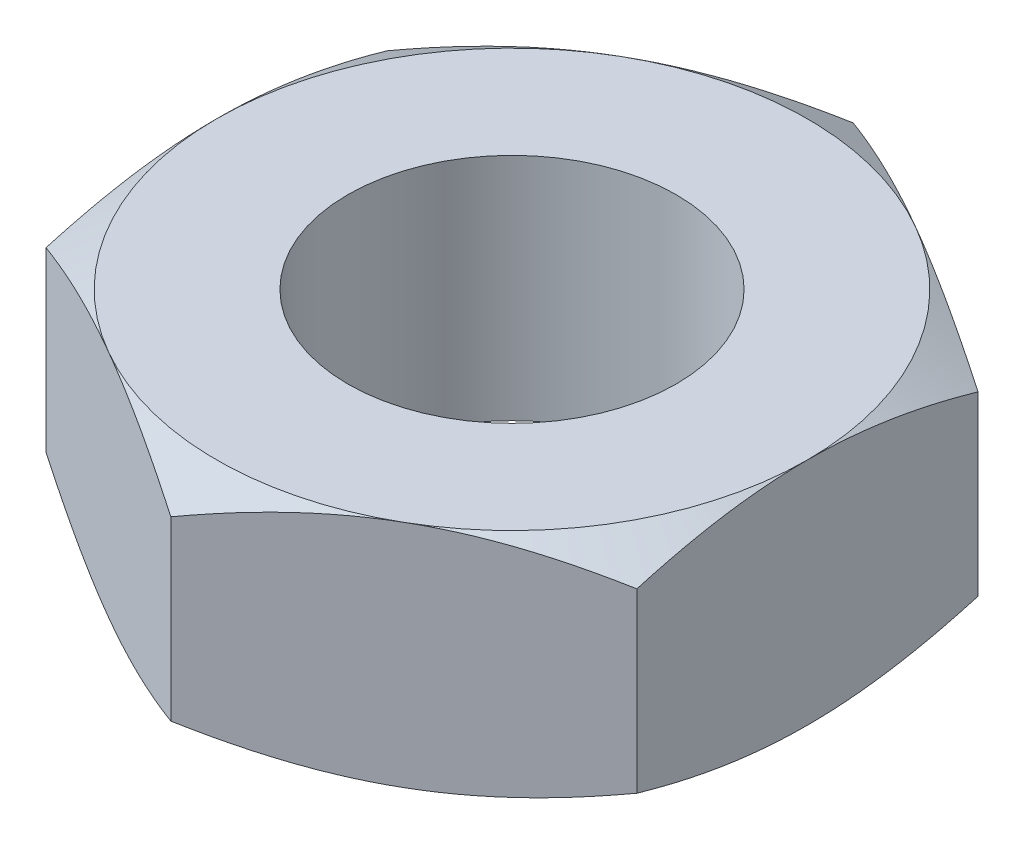
ISO-10303-21;
HEADER;
FILE_DESCRIPTION(('STEP AP214'),'2;1');
FILE_NAME('part.step','',(''),(''),'','','');
FILE_SCHEMA(('AUTOMOTIVE_DESIGN { 1 0 10303 214 1 1 1 1 }'));
ENDSEC;
DATA;
#1=APPLICATION_CONTEXT('core data for automotive mechanical design processes');
#2=APPLICATION_PROTOCOL_DEFINITION('international standard','automotive_design',2000,#1);
#3=PRODUCT_CONTEXT('',#1,'mechanical');
#4=PRODUCT('Part','Part','',(#3));
#5=PRODUCT_RELATED_PRODUCT_CATEGORY('part','',(#4));
#6=PRODUCT_DEFINITION_FORMATION('','',#4);
#7=PRODUCT_DEFINITION_CONTEXT('part definition',#1,'design');
#8=PRODUCT_DEFINITION('design','',#6,#7);
#9=PRODUCT_DEFINITION_SHAPE('','',#8);
#10=(LENGTH_UNIT() NAMED_UNIT(*) SI_UNIT(.MILLI.,.METRE.));
#11=(NAMED_UNIT(*) PLANE_ANGLE_UNIT() SI_UNIT($,.RADIAN.));
#12=(NAMED_UNIT(*) SI_UNIT($,.STERADIAN.) SOLID_ANGLE_UNIT());
#13=UNCERTAINTY_MEASURE_WITH_UNIT(LENGTH_MEASURE(1.E-05),#10,'distance_accuracy_value','');
#14=(GEOMETRIC_REPRESENTATION_CONTEXT(3) GLOBAL_UNCERTAINTY_ASSIGNED_CONTEXT((#13)) GLOBAL_UNIT_ASSIGNED_CONTEXT((#10,
#11,#12)) REPRESENTATION_CONTEXT('',''));
#15=CARTESIAN_POINT('',(0.,0.,0.));
#16=DIRECTION('',(0.,0.,1.));
#17=DIRECTION('',(1.,0.,0.));
#18=AXIS2_PLACEMENT_3D('',#15,#16,#17);
#19=CARTESIAN_POINT('',(-2.25,1.75,1.29903810567666));
#20=DIRECTION('',(0.5,0.,-0.866025403784439));
#21=DIRECTION('',(-0.866025403784439,0.,-0.5));
#22=AXIS2_PLACEMENT_3D('',#19,#20,#21);
#23=PLANE('',#22);
#24=CARTESIAN_POINT('',(0.000200000000000523,0.201028565434255,2.59819168140715));
#25=CARTESIAN_POINT('',(-0.0986772488143569,0.168055578047864,2.54110487518746));
#26=CARTESIAN_POINT('',(-0.198407997179093,0.138067535415598,2.48352530077259));
#27=CARTESIAN_POINT('',(-0.399596540220632,0.0857223882308779,2.36736904128969));
#28=CARTESIAN_POINT('',(-0.501057910502945,0.0633838027064784,2.30879029184485));
#29=CARTESIAN_POINT('',(-0.702723189801078,0.0286095576734186,2.19235878855587));
#30=CARTESIAN_POINT('',(-0.802896064976672,0.0159424738337182,2.13452395210774));
#31=CARTESIAN_POINT('',(-1.00371331260268,0.000818907417418888,2.01858206013295));
#32=CARTESIAN_POINT('',(-1.1043569548332,-0.00165009697600151,1.96047542619893));
#33=CARTESIAN_POINT('',(-1.29242516452656,0.00347837463602921,1.85189419470646));
#34=CARTESIAN_POINT('',(-1.37987784389126,0.00981663451512018,1.8014033667339));
#35=CARTESIAN_POINT('',(-1.55421343210877,0.0299076571898889,1.70075066794718));
#36=CARTESIAN_POINT('',(-1.64109573768829,0.0436672872310836,1.65058914543304));
#37=CARTESIAN_POINT('',(-1.81579095410174,0.0780662653506656,1.54972881521059));
#38=CARTESIAN_POINT('',(-1.90358174743525,0.0988514715826556,1.49904277704711));
#39=CARTESIAN_POINT('',(-2.0778537368776,0.146026087362979,1.39842679703037));
#40=CARTESIAN_POINT('',(-2.164337166751,0.172404408014302,1.34849556551251));
#41=CARTESIAN_POINT('',(-2.2502,0.201028565434255,1.29892263562282));
#42=B_SPLINE_CURVE_WITH_KNOTS('',3,(#24,#25,#26,#27,#28,#29,#30,#31,#32,#33,#34,#35,#36,#37,#38,
#39,#40,#41),.UNSPECIFIED.,.F.,.F.,(4,2,2,2,2,2,2,2,4),(0.,0.356658826016552,0.714175103224236,
1.06284241804968,1.41108149062516,1.71433394539794,2.01786749258222,2.32813511279245,
2.6377932546036),.UNSPECIFIED.);
#43=CARTESIAN_POINT('',(0.,0.200961894323341,2.59807621135332));
#44=VERTEX_POINT('',#43);
#45=CARTESIAN_POINT('',(-1.125,0.,1.94855715851499));
#46=VERTEX_POINT('',#45);
#47=EDGE_CURVE('E143',#44,#46,#42,.T.);
#48=ORIENTED_EDGE('',*,*,#47,.F.);
#49=DIRECTION('',(0.,-1.,0.));
#50=VECTOR('',#49,1.);
#51=CARTESIAN_POINT('',(0.,1.75,2.59807621135332));
#52=LINE('',#51,#50);
#53=CARTESIAN_POINT('',(0.,1.54903810567666,2.59807621135332));
#54=VERTEX_POINT('',#53);
#55=EDGE_CURVE('E155',#54,#44,#52,.T.);
#56=ORIENTED_EDGE('',*,*,#55,.F.);
#57=CARTESIAN_POINT('',(-2.2502,1.54897143456575,1.29892263562282));
#58=CARTESIAN_POINT('',(-2.15132275118564,1.58194442195214,1.35600944184252));
#59=CARTESIAN_POINT('',(-2.05159200282091,1.6119324645844,1.41358901625738));
#60=CARTESIAN_POINT('',(-1.85040345977937,1.66427761176912,1.52974527574028));
#61=CARTESIAN_POINT('',(-1.74894208949705,1.68661619729352,1.58832402518512));
#62=CARTESIAN_POINT('',(-1.54727681019892,1.72139044232658,1.7047555284741));
#63=CARTESIAN_POINT('',(-1.44710393502333,1.73405752616628,1.76259036492223));
#64=CARTESIAN_POINT('',(-1.24628668739732,1.74918109258258,1.87853225689702));
#65=CARTESIAN_POINT('',(-1.1456430451668,1.751650096976,1.93663889083104));
#66=CARTESIAN_POINT('',(-0.957574835473435,1.74652162536397,2.04522012232352));
#67=CARTESIAN_POINT('',(-0.870122156108742,1.74018336548488,2.09571095029608));
#68=CARTESIAN_POINT('',(-0.695786567891226,1.72009234281011,2.19636364908279));
#69=CARTESIAN_POINT('',(-0.608904262311712,1.70633271276892,2.24652517159694));
#70=CARTESIAN_POINT('',(-0.434209045898264,1.67193373464933,2.34738550181938));
#71=CARTESIAN_POINT('',(-0.346418252564746,1.65114852841734,2.39807153998286));
#72=CARTESIAN_POINT('',(-0.172146263122404,1.60397391263702,2.49868751999961));
#73=CARTESIAN_POINT('',(-0.085662833248997,1.5775955919857,2.54861875151746));
#74=CARTESIAN_POINT('',(0.000200000000000707,1.54897143456575,2.59819168140715));
#75=B_SPLINE_CURVE_WITH_KNOTS('',3,(#57,#58,#59,#60,#61,#62,#63,#64,#65,#66,#67,#68,#69,#70,#71,
#72,#73,#74),.UNSPECIFIED.,.F.,.F.,(4,2,2,2,2,2,2,2,4),(0.,0.356658826016552,0.714175103224236,
1.06284241804968,1.41108149062516,1.71433394539794,2.01786749258222,2.32813511279245,
2.63779325460359),.UNSPECIFIED.);
#76=CARTESIAN_POINT('',(-1.125,1.75,1.94855715851499));
#77=VERTEX_POINT('',#76);
#78=EDGE_CURVE('E315',#77,#54,#75,.T.);
#79=ORIENTED_EDGE('',*,*,#78,.F.);
#80=CARTESIAN_POINT('',(-2.25,1.54903810567666,1.29903810567667));
#81=VERTEX_POINT('',#80);
#82=EDGE_CURVE('E307',#81,#77,#75,.T.);
#83=ORIENTED_EDGE('',*,*,#82,.F.);
#84=DIRECTION('',(0.,-1.,0.));
#85=VECTOR('',#84,1.);
#86=CARTESIAN_POINT('',(-2.25,1.75,1.29903810567666));
#87=LINE('',#86,#85);
#88=CARTESIAN_POINT('',(-2.25,0.200961894323341,1.29903810567666));
#89=VERTEX_POINT('',#88);
#90=EDGE_CURVE('E240',#81,#89,#87,.T.);
#91=ORIENTED_EDGE('',*,*,#90,.T.);
#92=EDGE_CURVE('E206',#46,#89,#42,.T.);
#93=ORIENTED_EDGE('',*,*,#92,.F.);
#94=EDGE_LOOP('',(#48,#56,#79,#83,#91,#93));
#95=FACE_BOUND('',#94,.T.);
#96=ADVANCED_FACE('F35',(#95),#23,.F.);
#97=CARTESIAN_POINT('',(0.,1.75,2.59807621135332));
#98=DIRECTION('',(-0.5,0.,-0.866025403784439));
#99=DIRECTION('',(-0.866025403784439,0.,0.5));
#100=AXIS2_PLACEMENT_3D('',#97,#98,#99);
#101=PLANE('',#100);
#102=CARTESIAN_POINT('',(2.2502,0.201028565434255,1.29892263562282));
#103=CARTESIAN_POINT('',(2.15132275118564,0.168055578047864,1.35600944184252));
#104=CARTESIAN_POINT('',(2.05159200282091,0.138067535415598,1.41358901625738));
#105=CARTESIAN_POINT('',(1.85040345977937,0.0857223882308781,1.52974527574028));
#106=CARTESIAN_POINT('',(1.74894208949705,0.0633838027064787,1.58832402518512));
#107=CARTESIAN_POINT('',(1.54727681019892,0.0286095576734188,1.7047555284741));
#108=CARTESIAN_POINT('',(1.44710393502333,0.0159424738337183,1.76259036492223));
#109=CARTESIAN_POINT('',(1.24628668739732,0.000818907417418837,1.87853225689702));
#110=CARTESIAN_POINT('',(1.1456430451668,-0.00165009697600152,1.93663889083104));
#111=CARTESIAN_POINT('',(0.957574835473435,0.00347837463602933,2.04522012232352));
#112=CARTESIAN_POINT('',(0.870122156108742,0.00981663451512037,2.09571095029608));
#113=CARTESIAN_POINT('',(0.695786567891226,0.0299076571898891,2.19636364908279));
#114=CARTESIAN_POINT('',(0.608904262311712,0.0436672872310836,2.24652517159694));
#115=CARTESIAN_POINT('',(0.434209045898264,0.0780662653506655,2.34738550181938));
#116=CARTESIAN_POINT('',(0.346418252564747,0.0988514715826555,2.39807153998286));
#117=CARTESIAN_POINT('',(0.172146263122405,0.146026087362979,2.49868751999961));
#118=CARTESIAN_POINT('',(0.0856628332489982,0.172404408014302,2.54861875151746));
#119=CARTESIAN_POINT('',(-0.000199999999999547,0.201028565434255,2.59819168140715));
#120=B_SPLINE_CURVE_WITH_KNOTS('',3,(#102,#103,#104,#105,#106,#107,#108,#109,#110,#111,#112,
#113,#114,#115,#116,#117,#118,#119),.UNSPECIFIED.,.F.,.F.,(4,2,2,2,2,2,2,2,4),(0.,
0.356658826016552,0.714175103224236,1.06284241804968,1.41108149062516,1.71433394539794,
2.01786749258222,2.32813511279245,2.63779325460359),.UNSPECIFIED.);
#121=CARTESIAN_POINT('',(2.25,0.200961894323341,1.29903810567666));
#122=VERTEX_POINT('',#121);
#123=CARTESIAN_POINT('',(1.125,0.,1.94855715851499));
#124=VERTEX_POINT('',#123);
#125=EDGE_CURVE('E124',#122,#124,#120,.T.);
#126=ORIENTED_EDGE('',*,*,#125,.F.);
#127=DIRECTION('',(0.,-1.,0.));
#128=VECTOR('',#127,1.);
#129=CARTESIAN_POINT('',(2.25,1.75,1.29903810567666));
#130=LINE('',#129,#128);
#131=CARTESIAN_POINT('',(2.25,1.54903810567666,1.29903810567666));
#132=VERTEX_POINT('',#131);
#133=EDGE_CURVE('E237',#132,#122,#130,.T.);
#134=ORIENTED_EDGE('',*,*,#133,.F.);
#135=CARTESIAN_POINT('',(-0.00019999999999962,1.54897143456575,2.59819168140715));
#136=CARTESIAN_POINT('',(0.0986772488143578,1.58194442195214,2.54110487518745));
#137=CARTESIAN_POINT('',(0.198407997179094,1.6119324645844,2.48352530077259));
#138=CARTESIAN_POINT('',(0.399596540220633,1.66427761176912,2.36736904128969));
#139=CARTESIAN_POINT('',(0.501057910502946,1.68661619729352,2.30879029184485));
#140=CARTESIAN_POINT('',(0.702723189801079,1.72139044232658,2.19235878855587));
#141=CARTESIAN_POINT('',(0.802896064976672,1.73405752616628,2.13452395210774));
#142=CARTESIAN_POINT('',(1.00371331260268,1.74918109258258,2.01858206013295));
#143=CARTESIAN_POINT('',(1.1043569548332,1.751650096976,1.96047542619893));
#144=CARTESIAN_POINT('',(1.29242516452657,1.74652162536397,1.85189419470646));
#145=CARTESIAN_POINT('',(1.37987784389126,1.74018336548488,1.8014033667339));
#146=CARTESIAN_POINT('',(1.55421343210877,1.72009234281011,1.70075066794718));
#147=CARTESIAN_POINT('',(1.64109573768829,1.70633271276892,1.65058914543304));
#148=CARTESIAN_POINT('',(1.81579095410174,1.67193373464933,1.54972881521059));
#149=CARTESIAN_POINT('',(1.90358174743525,1.65114852841734,1.49904277704711));
#150=CARTESIAN_POINT('',(2.0778537368776,1.60397391263702,1.39842679703037));
#151=CARTESIAN_POINT('',(2.164337166751,1.5775955919857,1.34849556551251));
#152=CARTESIAN_POINT('',(2.2502,1.54897143456575,1.29892263562282));
#153=B_SPLINE_CURVE_WITH_KNOTS('',3,(#135,#136,#137,#138,#139,#140,#141,#142,#143,#144,#145,
#146,#147,#148,#149,#150,#151,#152),.UNSPECIFIED.,.F.,.F.,(4,2,2,2,2,2,2,2,4),(0.,
0.356658826016552,0.714175103224236,1.06284241804968,1.41108149062516,1.71433394539794,
2.01786749258222,2.32813511279245,2.63779325460359),.UNSPECIFIED.);
#154=CARTESIAN_POINT('',(1.125,1.75,1.94855715851499));
#155=VERTEX_POINT('',#154);
#156=EDGE_CURVE('E283',#155,#132,#153,.T.);
#157=ORIENTED_EDGE('',*,*,#156,.F.);
#158=EDGE_CURVE('E320',#54,#155,#153,.T.);
#159=ORIENTED_EDGE('',*,*,#158,.F.);
#160=ORIENTED_EDGE('',*,*,#55,.T.);
#161=EDGE_CURVE('E136',#124,#44,#120,.T.);
#162=ORIENTED_EDGE('',*,*,#161,.F.);
#163=EDGE_LOOP('',(#126,#134,#157,#159,#160,#162));
#164=FACE_BOUND('',#163,.T.);
#165=ADVANCED_FACE('F152',(#164),#101,.F.);
#166=CARTESIAN_POINT('',(2.25,1.75,1.29903810567666));
#167=DIRECTION('',(-1.,0.,0.));
#168=DIRECTION('',(0.,0.,1.));
#169=AXIS2_PLACEMENT_3D('',#166,#167,#168);
#170=PLANE('',#169);
#171=CARTESIAN_POINT('',(2.25,1.57049861982334,-4.43172912721208));
#172=CARTESIAN_POINT('',(2.25,1.51735693759208,-4.32848794492226));
#173=CARTESIAN_POINT('',(2.25,1.46450484743296,-4.22509639331572));
#174=CARTESIAN_POINT('',(2.25,1.35952530789621,-4.01794384416323));
#175=CARTESIAN_POINT('',(2.25,1.30739787204856,-3.91418283976455));
#176=CARTESIAN_POINT('',(2.25,1.20393081844307,-3.70605700815304));
#177=CARTESIAN_POINT('',(2.25,1.1525926236047,-3.60169147231438));
#178=CARTESIAN_POINT('',(2.25,1.05099117669964,-3.39243582155597));
#179=CARTESIAN_POINT('',(2.25,1.000727939927,-3.28754569919877));
#180=CARTESIAN_POINT('',(2.25,0.898925995293035,-3.07160047020286));
#181=CARTESIAN_POINT('',(2.25,0.847459290612846,-2.96051132352861));
#182=CARTESIAN_POINT('',(2.25,0.746406212005018,-2.73748183196732));
#183=CARTESIAN_POINT('',(2.25,0.696819787356087,-2.62554151013899));
#184=CARTESIAN_POINT('',(2.25,0.600100967453589,-2.40069008962637));
#185=CARTESIAN_POINT('',(2.25,0.552966929054417,-2.2877797015774));
#186=CARTESIAN_POINT('',(2.25,0.46184651106863,-2.06065851247683));
#187=CARTESIAN_POINT('',(2.25,0.417860865336629,-1.94644741538902));
#188=CARTESIAN_POINT('',(2.25,0.327293685566711,-1.69797138865069));
#189=CARTESIAN_POINT('',(2.25,0.281435016134631,-1.56343919862733));
#190=CARTESIAN_POINT('',(2.25,0.1974750705298,-1.29200018214826));
#191=CARTESIAN_POINT('',(2.25,0.159369866726331,-1.15509459630545));
#192=CARTESIAN_POINT('',(2.25,0.0942889667848679,-0.881369269399072));
#193=CARTESIAN_POINT('',(2.25,0.0671140468085101,-0.744598126937424));
#194=CARTESIAN_POINT('',(2.25,0.0257222330991211,-0.469086445681223));
#195=CARTESIAN_POINT('',(2.25,0.011497745246213,-0.330347109575203));
#196=CARTESIAN_POINT('',(2.25,0.00123269639131384,-0.120784370517545));
#197=CARTESIAN_POINT('',(2.25,-0.000315601094854527,-0.050203974634935));
#198=CARTESIAN_POINT('',(2.25,0.000422033997697038,0.0909367469657695));
#199=CARTESIAN_POINT('',(2.25,0.00270796730213807,0.161497072680062));
#200=CARTESIAN_POINT('',(2.25,0.0152377813490387,0.372864383623227));
#201=CARTESIAN_POINT('',(2.25,0.031153514657774,0.51336108414487));
#202=CARTESIAN_POINT('',(2.25,0.0764279690031744,0.79498241315873));
#203=CARTESIAN_POINT('',(2.25,0.106052731323689,0.936062007316041));
#204=CARTESIAN_POINT('',(2.25,0.175669429631058,1.21561548141805));
#205=CARTESIAN_POINT('',(2.25,0.215664560549491,1.35408854420889));
#206=CARTESIAN_POINT('',(2.25,0.301433813240795,1.62298376559588));
#207=CARTESIAN_POINT('',(2.25,0.34690627294026,1.75350414338493));
#208=CARTESIAN_POINT('',(2.25,0.442941824020628,2.01267340913791));
#209=CARTESIAN_POINT('',(2.25,0.493506146306573,2.14132183593333));
#210=CARTESIAN_POINT('',(2.25,0.598415917250672,2.3972089614727));
#211=CARTESIAN_POINT('',(2.25,0.652765191067169,2.5244460788882));
#212=CARTESIAN_POINT('',(2.25,0.7642440388293,2.77769813848635));
#213=CARTESIAN_POINT('',(2.25,0.821373763792895,2.9037130138371));
#214=CARTESIAN_POINT('',(2.25,0.934436062749627,3.1476496239965));
#215=CARTESIAN_POINT('',(2.25,0.990252927298658,3.26562520727676));
#216=CARTESIAN_POINT('',(2.25,1.10334942732948,3.50087634814471));
#217=CARTESIAN_POINT('',(2.25,1.16062911044141,3.61815188278466));
#218=CARTESIAN_POINT('',(2.25,1.27615326827056,3.85174791850405));
#219=CARTESIAN_POINT('',(2.25,1.3343939714757,3.96807028911018));
#220=CARTESIAN_POINT('',(2.25,1.45180296105985,4.20023381118101));
#221=CARTESIAN_POINT('',(2.25,1.51097116762094,4.31607500298083));
#222=CARTESIAN_POINT('',(2.25,1.57049861982334,4.43172912721208));
#223=B_SPLINE_CURVE_WITH_KNOTS('',3,(#171,#172,#173,#174,#175,#176,#177,#178,#179,#180,#181,
#182,#183,#184,#185,#186,#187,#188,#189,#190,#191,#192,#193,#194,#195,#196,#197,#198,#199,#200,
#201,#202,#203,#204,#205,#206,#207,#208,#209,#210,#211,#212,#213,#214,#215,#216,#217,#218,#219,
#220,#221,#222),.UNSPECIFIED.,.F.,.F.,(4,2,2,2,2,2,2,2,2,2,2,2,2,2,2,2,2,2,2,2,2,2,2,2,2,4),(0.,
0.348347395383933,0.696701286027883,1.04562309484171,1.39454986466947,1.76183249981756,
2.12910522031385,2.49612860556298,2.86323726307789,3.2894710608127,3.71548840311864,
4.13334452619794,4.55095546076511,4.7626532574073,4.97435109411843,5.39773666667533,
5.82970728415092,6.26181114277157,6.67631854142574,7.09092638459783,7.50595949709434,
7.92101517699111,8.31254332110153,8.70408422986847,9.09434358465051,9.48456953737431),.UNSPECIFIED.);
#224=CARTESIAN_POINT('',(2.25,0.200961894323341,-1.29903810567666));
#225=VERTEX_POINT('',#224);
#226=CARTESIAN_POINT('',(2.25,0.,0.));
#227=VERTEX_POINT('',#226);
#228=EDGE_CURVE('E51',#225,#227,#223,.T.);
#229=ORIENTED_EDGE('',*,*,#228,.F.);
#230=DIRECTION('',(0.,-1.,0.));
#231=VECTOR('',#230,1.);
#232=CARTESIAN_POINT('',(2.25,1.75,-1.29903810567666));
#233=LINE('',#232,#231);
#234=CARTESIAN_POINT('',(2.25,1.54903810567666,-1.29903810567666));
#235=VERTEX_POINT('',#234);
#236=EDGE_CURVE('E234',#235,#225,#233,.T.);
#237=ORIENTED_EDGE('',*,*,#236,.F.);
#238=CARTESIAN_POINT('',(2.25,0.179501380176658,4.43172912721208));
#239=CARTESIAN_POINT('',(2.25,0.232643062407915,4.32848794492226));
#240=CARTESIAN_POINT('',(2.25,0.285495152567038,4.22509639331572));
#241=CARTESIAN_POINT('',(2.25,0.390474692103787,4.01794384416323));
#242=CARTESIAN_POINT('',(2.25,0.442602127951438,3.91418283976455));
#243=CARTESIAN_POINT('',(2.25,0.546069181556927,3.70605700815303));
#244=CARTESIAN_POINT('',(2.25,0.597407376395302,3.60169147231438));
#245=CARTESIAN_POINT('',(2.25,0.699008823300362,3.39243582155597));
#246=CARTESIAN_POINT('',(2.25,0.749272060072998,3.28754569919877));
#247=CARTESIAN_POINT('',(2.25,0.851074004706965,3.07160047020285));
#248=CARTESIAN_POINT('',(2.25,0.902540709387154,2.96051132352861));
#249=CARTESIAN_POINT('',(2.25,1.00359378799498,2.73748183196732));
#250=CARTESIAN_POINT('',(2.25,1.05318021264391,2.62554151013899));
#251=CARTESIAN_POINT('',(2.25,1.14989903254641,2.40069008962636));
#252=CARTESIAN_POINT('',(2.25,1.19703307094558,2.28777970157739));
#253=CARTESIAN_POINT('',(2.25,1.28815348893137,2.06065851247683));
#254=CARTESIAN_POINT('',(2.25,1.33213913466337,1.94644741538902));
#255=CARTESIAN_POINT('',(2.25,1.42270631443329,1.69797138865069));
#256=CARTESIAN_POINT('',(2.25,1.46856498386537,1.56343919862733));
#257=CARTESIAN_POINT('',(2.25,1.5525249294702,1.29200018214826));
#258=CARTESIAN_POINT('',(2.25,1.59063013327367,1.15509459630545));
#259=CARTESIAN_POINT('',(2.25,1.65571103321513,0.88136926939907));
#260=CARTESIAN_POINT('',(2.25,1.68288595319149,0.744598126937421));
#261=CARTESIAN_POINT('',(2.25,1.72427776690088,0.469086445681221));
#262=CARTESIAN_POINT('',(2.25,1.73850225475379,0.3303471095752));
#263=CARTESIAN_POINT('',(2.25,1.74876730360869,0.120784370517543));
#264=CARTESIAN_POINT('',(2.25,1.75031560109485,0.0502039746349321));
#265=CARTESIAN_POINT('',(2.25,1.7495779660023,-0.0909367469657725));
#266=CARTESIAN_POINT('',(2.25,1.74729203269786,-0.161497072680065));
#267=CARTESIAN_POINT('',(2.25,1.73476221865096,-0.37286438362323));
#268=CARTESIAN_POINT('',(2.25,1.71884648534223,-0.513361084144873));
#269=CARTESIAN_POINT('',(2.25,1.67357203099683,-0.794982413158732));
#270=CARTESIAN_POINT('',(2.25,1.64394726867631,-0.936062007316043));
#271=CARTESIAN_POINT('',(2.25,1.57433057036894,-1.21561548141806));
#272=CARTESIAN_POINT('',(2.25,1.53433543945051,-1.35408854420889));
#273=CARTESIAN_POINT('',(2.25,1.4485661867592,-1.62298376559588));
#274=CARTESIAN_POINT('',(2.25,1.40309372705974,-1.75350414338493));
#275=CARTESIAN_POINT('',(2.25,1.30705817597937,-2.01267340913791));
#276=CARTESIAN_POINT('',(2.25,1.25649385369343,-2.14132183593333));
#277=CARTESIAN_POINT('',(2.25,1.15158408274933,-2.39720896147271));
#278=CARTESIAN_POINT('',(2.25,1.09723480893283,-2.5244460788882));
#279=CARTESIAN_POINT('',(2.25,0.9857559611707,-2.77769813848635));
#280=CARTESIAN_POINT('',(2.25,0.928626236207105,-2.9037130138371));
#281=CARTESIAN_POINT('',(2.25,0.815563937250374,-3.1476496239965));
#282=CARTESIAN_POINT('',(2.25,0.759747072701343,-3.26562520727677));
#283=CARTESIAN_POINT('',(2.25,0.646650572670522,-3.50087634814471));
#284=CARTESIAN_POINT('',(2.25,0.589370889558592,-3.61815188278466));
#285=CARTESIAN_POINT('',(2.25,0.473846731729441,-3.85174791850405));
#286=CARTESIAN_POINT('',(2.25,0.415606028524299,-3.96807028911018));
#287=CARTESIAN_POINT('',(2.25,0.298197038940151,-4.20023381118101));
#288=CARTESIAN_POINT('',(2.25,0.239028832379062,-4.31607500298083));
#289=CARTESIAN_POINT('',(2.25,0.179501380176659,-4.43172912721208));
#290=B_SPLINE_CURVE_WITH_KNOTS('',3,(#238,#239,#240,#241,#242,#243,#244,#245,#246,#247,#248,
#249,#250,#251,#252,#253,#254,#255,#256,#257,#258,#259,#260,#261,#262,#263,#264,#265,#266,#267,
#268,#269,#270,#271,#272,#273,#274,#275,#276,#277,#278,#279,#280,#281,#282,#283,#284,#285,#286,
#287,#288,#289),.UNSPECIFIED.,.F.,.F.,(4,2,2,2,2,2,2,2,2,2,2,2,2,2,2,2,2,2,2,2,2,2,2,2,2,4),(0.,
0.348347395383933,0.696701286027884,1.04562309484171,1.39454986466947,1.76183249981756,
2.12910522031386,2.49612860556298,2.86323726307789,3.2894710608127,3.71548840311864,
4.13334452619794,4.55095546076511,4.7626532574073,4.97435109411843,5.39773666667533,
5.82970728415093,6.26181114277157,6.67631854142574,7.09092638459783,7.50595949709434,
7.92101517699111,8.31254332110153,8.70408422986847,9.09434358465051,9.48456953737431),.UNSPECIFIED.);
#291=CARTESIAN_POINT('',(2.25,1.75,0.));
#292=VERTEX_POINT('',#291);
#293=EDGE_CURVE('E276',#292,#235,#290,.T.);
#294=ORIENTED_EDGE('',*,*,#293,.F.);
#295=EDGE_CURVE('E282',#132,#292,#290,.T.);
#296=ORIENTED_EDGE('',*,*,#295,.F.);
#297=ORIENTED_EDGE('',*,*,#133,.T.);
#298=EDGE_CURVE('E130',#227,#122,#223,.T.);
#299=ORIENTED_EDGE('',*,*,#298,.F.);
#300=EDGE_LOOP('',(#229,#237,#294,#296,#297,#299));
#301=FACE_BOUND('',#300,.T.);
#302=ADVANCED_FACE('F289',(#301),#170,.F.);
#303=CARTESIAN_POINT('',(2.25,1.75,-1.29903810567666));
#304=DIRECTION('',(-0.5,0.,0.866025403784439));
#305=DIRECTION('',(0.866025403784439,0.,0.5));
#306=AXIS2_PLACEMENT_3D('',#303,#304,#305);
#307=PLANE('',#306);
#308=CARTESIAN_POINT('',(-0.00020000000000001,0.201028565434255,-2.59819168140715));
#309=CARTESIAN_POINT('',(0.0986772488143572,0.168055578047864,-2.54110487518746));
#310=CARTESIAN_POINT('',(0.198407997179093,0.138067535415598,-2.48352530077259));
#311=CARTESIAN_POINT('',(0.399596540220633,0.0857223882308782,-2.36736904128969));
#312=CARTESIAN_POINT('',(0.501057910502945,0.0633838027064791,-2.30879029184485));
#313=CARTESIAN_POINT('',(0.702723189801079,0.0286095576734193,-2.19235878855587));
#314=CARTESIAN_POINT('',(0.802896064976672,0.0159424738337187,-2.13452395210774));
#315=CARTESIAN_POINT('',(1.00371331260268,0.000818907417419268,-2.01858206013295));
#316=CARTESIAN_POINT('',(1.1043569548332,-0.00165009697600104,-1.96047542619893));
#317=CARTESIAN_POINT('',(1.29242516452656,0.00347837463602972,-1.85189419470646));
#318=CARTESIAN_POINT('',(1.37987784389126,0.00981663451512064,-1.8014033667339));
#319=CARTESIAN_POINT('',(1.55421343210877,0.0299076571898894,-1.70075066794718));
#320=CARTESIAN_POINT('',(1.64109573768829,0.043667287231084,-1.65058914543304));
#321=CARTESIAN_POINT('',(1.81579095410174,0.0780662653506659,-1.54972881521059));
#322=CARTESIAN_POINT('',(1.90358174743525,0.0988514715826557,-1.49904277704712));
#323=CARTESIAN_POINT('',(2.07785373687759,0.146026087362979,-1.39842679703037));
#324=CARTESIAN_POINT('',(2.164337166751,0.172404408014302,-1.34849556551252));
#325=CARTESIAN_POINT('',(2.2502,0.201028565434254,-1.29892263562282));
#326=B_SPLINE_CURVE_WITH_KNOTS('',3,(#308,#309,#310,#311,#312,#313,#314,#315,#316,#317,#318,
#319,#320,#321,#322,#323,#324,#325),.UNSPECIFIED.,.F.,.F.,(4,2,2,2,2,2,2,2,4),(0.,
0.356658826016552,0.714175103224236,1.06284241804968,1.41108149062516,1.71433394539794,
2.01786749258222,2.32813511279245,2.63779325460359),.UNSPECIFIED.);
#327=CARTESIAN_POINT('',(0.,0.200961894323341,-2.59807621135332));
#328=VERTEX_POINT('',#327);
#329=CARTESIAN_POINT('',(1.125,0.,-1.94855715851499));
#330=VERTEX_POINT('',#329);
#331=EDGE_CURVE('E58',#328,#330,#326,.T.);
#332=ORIENTED_EDGE('',*,*,#331,.F.);
#333=DIRECTION('',(0.,-1.,0.));
#334=VECTOR('',#333,1.);
#335=CARTESIAN_POINT('',(0.,1.75,-2.59807621135332));
#336=LINE('',#335,#334);
#337=CARTESIAN_POINT('',(0.,1.54903810567666,-2.59807621135332));
#338=VERTEX_POINT('',#337);
#339=EDGE_CURVE('E227',#338,#328,#336,.T.);
#340=ORIENTED_EDGE('',*,*,#339,.F.);
#341=CARTESIAN_POINT('',(2.2502,1.54897143456575,-1.29892263562282));
#342=CARTESIAN_POINT('',(2.15132275118564,1.58194442195214,-1.35600944184252));
#343=CARTESIAN_POINT('',(2.05159200282091,1.6119324645844,-1.41358901625738));
#344=CARTESIAN_POINT('',(1.85040345977937,1.66427761176912,-1.52974527574029));
#345=CARTESIAN_POINT('',(1.74894208949705,1.68661619729352,-1.58832402518513));
#346=CARTESIAN_POINT('',(1.54727681019892,1.72139044232658,-1.70475552847411));
#347=CARTESIAN_POINT('',(1.44710393502333,1.73405752616628,-1.76259036492223));
#348=CARTESIAN_POINT('',(1.24628668739732,1.74918109258258,-1.87853225689703));
#349=CARTESIAN_POINT('',(1.1456430451668,1.751650096976,-1.93663889083104));
#350=CARTESIAN_POINT('',(0.957574835473433,1.74652162536397,-2.04522012232352));
#351=CARTESIAN_POINT('',(0.87012215610874,1.74018336548488,-2.09571095029608));
#352=CARTESIAN_POINT('',(0.695786567891225,1.72009234281011,-2.19636364908279));
#353=CARTESIAN_POINT('',(0.608904262311711,1.70633271276892,-2.24652517159694));
#354=CARTESIAN_POINT('',(0.434209045898263,1.67193373464933,-2.34738550181938));
#355=CARTESIAN_POINT('',(0.346418252564745,1.65114852841734,-2.39807153998286));
#356=CARTESIAN_POINT('',(0.172146263122404,1.60397391263702,-2.49868751999961));
#357=CARTESIAN_POINT('',(0.0856628332489973,1.5775955919857,-2.54861875151746));
#358=CARTESIAN_POINT('',(-0.000200000000000204,1.54897143456575,-2.59819168140715));
#359=B_SPLINE_CURVE_WITH_KNOTS('',3,(#341,#342,#343,#344,#345,#346,#347,#348,#349,#350,#351,
#352,#353,#354,#355,#356,#357,#358),.UNSPECIFIED.,.F.,.F.,(4,2,2,2,2,2,2,2,4),(0.,
0.356658826016552,0.714175103224237,1.06284241804968,1.41108149062516,1.71433394539794,
2.01786749258222,2.32813511279245,2.63779325460359),.UNSPECIFIED.);
#360=CARTESIAN_POINT('',(1.125,1.75,-1.94855715851499));
#361=VERTEX_POINT('',#360);
#362=EDGE_CURVE('E269',#361,#338,#359,.T.);
#363=ORIENTED_EDGE('',*,*,#362,.F.);
#364=EDGE_CURVE('E275',#235,#361,#359,.T.);
#365=ORIENTED_EDGE('',*,*,#364,.F.);
#366=ORIENTED_EDGE('',*,*,#236,.T.);
#367=EDGE_CURVE('E135',#330,#225,#326,.T.);
#368=ORIENTED_EDGE('',*,*,#367,.F.);
#369=EDGE_LOOP('',(#332,#340,#363,#365,#366,#368));
#370=FACE_BOUND('',#369,.T.);
#371=ADVANCED_FACE('F225',(#370),#307,.F.);
#372=CARTESIAN_POINT('',(0.,1.75,-2.59807621135332));
#373=DIRECTION('',(0.5,0.,0.866025403784439));
#374=DIRECTION('',(0.866025403784439,0.,-0.5));
#375=AXIS2_PLACEMENT_3D('',#372,#373,#374);
#376=PLANE('',#375);
#377=CARTESIAN_POINT('',(-2.2502,0.201028565434255,-1.29892263562282));
#378=CARTESIAN_POINT('',(-2.15132275118564,0.168055578047864,-1.35600944184252));
#379=CARTESIAN_POINT('',(-2.05159200282091,0.138067535415598,-1.41358901625738));
#380=CARTESIAN_POINT('',(-1.85040345977937,0.0857223882308784,-1.52974527574028));
#381=CARTESIAN_POINT('',(-1.74894208949706,0.063383802706479,-1.58832402518512));
#382=CARTESIAN_POINT('',(-1.54727681019892,0.0286095576734191,-1.7047555284741));
#383=CARTESIAN_POINT('',(-1.44710393502333,0.0159424738337186,-1.76259036492223));
#384=CARTESIAN_POINT('',(-1.24628668739732,0.000818907417419059,-1.87853225689702));
#385=CARTESIAN_POINT('',(-1.1456430451668,-0.00165009697600128,-1.93663889083104));
#386=CARTESIAN_POINT('',(-0.957574835473436,0.00347837463602959,-2.04522012232352));
#387=CARTESIAN_POINT('',(-0.870122156108743,0.00981663451512065,-2.09571095029608));
#388=CARTESIAN_POINT('',(-0.695786567891226,0.0299076571898893,-2.19636364908279));
#389=CARTESIAN_POINT('',(-0.608904262311712,0.0436672872310837,-2.24652517159694));
#390=CARTESIAN_POINT('',(-0.434209045898264,0.0780662653506655,-2.34738550181938));
#391=CARTESIAN_POINT('',(-0.346418252564747,0.0988514715826556,-2.39807153998286));
#392=CARTESIAN_POINT('',(-0.172146263122405,0.14602608736298,-2.49868751999961));
#393=CARTESIAN_POINT('',(-0.0856628332489976,0.172404408014302,-2.54861875151746));
#394=CARTESIAN_POINT('',(0.0002000000000001,0.201028565434255,-2.59819168140715));
#395=B_SPLINE_CURVE_WITH_KNOTS('',3,(#377,#378,#379,#380,#381,#382,#383,#384,#385,#386,#387,
#388,#389,#390,#391,#392,#393,#394),.UNSPECIFIED.,.F.,.F.,(4,2,2,2,2,2,2,2,4),(0.,
0.356658826016552,0.714175103224236,1.06284241804968,1.41108149062516,1.71433394539794,
2.01786749258222,2.32813511279245,2.63779325460359),.UNSPECIFIED.);
#396=CARTESIAN_POINT('',(-2.25,0.200961894323336,-1.29903810567667));
#397=VERTEX_POINT('',#396);
#398=CARTESIAN_POINT('',(-1.125,0.,-1.94855715851499));
#399=VERTEX_POINT('',#398);
#400=EDGE_CURVE('E200',#397,#399,#395,.T.);
#401=ORIENTED_EDGE('',*,*,#400,.F.);
#402=DIRECTION('',(0.,-1.,0.));
#403=VECTOR('',#402,1.);
#404=CARTESIAN_POINT('',(-2.25,1.75,-1.29903810567666));
#405=LINE('',#404,#403);
#406=CARTESIAN_POINT('',(-2.25,1.54903810567666,-1.29903810567666));
#407=VERTEX_POINT('',#406);
#408=EDGE_CURVE('E235',#407,#397,#405,.T.);
#409=ORIENTED_EDGE('',*,*,#408,.F.);
#410=CARTESIAN_POINT('',(0.000200000000000065,1.54897143456575,-2.59819168140715));
#411=CARTESIAN_POINT('',(-0.0986772488143573,1.58194442195214,-2.54110487518746));
#412=CARTESIAN_POINT('',(-0.198407997179093,1.6119324645844,-2.48352530077259));
#413=CARTESIAN_POINT('',(-0.399596540220633,1.66427761176912,-2.36736904128969));
#414=CARTESIAN_POINT('',(-0.501057910502945,1.68661619729352,-2.30879029184485));
#415=CARTESIAN_POINT('',(-0.702723189801079,1.72139044232658,-2.19235878855587));
#416=CARTESIAN_POINT('',(-0.802896064976672,1.73405752616628,-2.13452395210774));
#417=CARTESIAN_POINT('',(-1.00371331260268,1.74918109258258,-2.01858206013295));
#418=CARTESIAN_POINT('',(-1.1043569548332,1.751650096976,-1.96047542619893));
#419=CARTESIAN_POINT('',(-1.29242516452657,1.74652162536397,-1.85189419470646));
#420=CARTESIAN_POINT('',(-1.37987784389126,1.74018336548488,-1.8014033667339));
#421=CARTESIAN_POINT('',(-1.55421343210877,1.72009234281011,-1.70075066794718));
#422=CARTESIAN_POINT('',(-1.64109573768829,1.70633271276892,-1.65058914543304));
#423=CARTESIAN_POINT('',(-1.81579095410174,1.67193373464933,-1.54972881521059));
#424=CARTESIAN_POINT('',(-1.90358174743525,1.65114852841734,-1.49904277704711));
#425=CARTESIAN_POINT('',(-2.0778537368776,1.60397391263702,-1.39842679703037));
#426=CARTESIAN_POINT('',(-2.164337166751,1.5775955919857,-1.34849556551251));
#427=CARTESIAN_POINT('',(-2.2502,1.54897143456575,-1.29892263562282));
#428=B_SPLINE_CURVE_WITH_KNOTS('',3,(#410,#411,#412,#413,#414,#415,#416,#417,#418,#419,#420,
#421,#422,#423,#424,#425,#426,#427),.UNSPECIFIED.,.F.,.F.,(4,2,2,2,2,2,2,2,4),(0.,
0.356658826016552,0.714175103224236,1.06284241804968,1.41108149062516,1.71433394539794,
2.01786749258222,2.32813511279245,2.63779325460359),.UNSPECIFIED.);
#429=CARTESIAN_POINT('',(-1.125,1.75,-1.94855715851499));
#430=VERTEX_POINT('',#429);
#431=EDGE_CURVE('E262',#430,#407,#428,.T.);
#432=ORIENTED_EDGE('',*,*,#431,.F.);
#433=EDGE_CURVE('E233',#338,#430,#428,.T.);
#434=ORIENTED_EDGE('',*,*,#433,.F.);
#435=ORIENTED_EDGE('',*,*,#339,.T.);
#436=EDGE_CURVE('E156',#399,#328,#395,.T.);
#437=ORIENTED_EDGE('',*,*,#436,.F.);
#438=EDGE_LOOP('',(#401,#409,#432,#434,#435,#437));
#439=FACE_BOUND('',#438,.T.);
#440=ADVANCED_FACE('F230',(#439),#376,.F.);
#441=CARTESIAN_POINT('',(-2.25,1.75,-1.29903810567666));
#442=DIRECTION('',(1.,0.,0.));
#443=DIRECTION('',(0.,0.,-1.));
#444=AXIS2_PLACEMENT_3D('',#441,#442,#443);
#445=PLANE('',#444);
#446=CARTESIAN_POINT('',(-2.25,1.57049861982334,4.43172912721207));
#447=CARTESIAN_POINT('',(-2.25,1.51735693759208,4.32848794492226));
#448=CARTESIAN_POINT('',(-2.25,1.46450484743296,4.22509639331572));
#449=CARTESIAN_POINT('',(-2.25,1.35952530789621,4.01794384416323));
#450=CARTESIAN_POINT('',(-2.25,1.30739787204856,3.91418283976455));
#451=CARTESIAN_POINT('',(-2.25,1.20393081844307,3.70605700815303));
#452=CARTESIAN_POINT('',(-2.25,1.1525926236047,3.60169147231438));
#453=CARTESIAN_POINT('',(-2.25,1.05099117669964,3.39243582155596));
#454=CARTESIAN_POINT('',(-2.25,1.000727939927,3.28754569919877));
#455=CARTESIAN_POINT('',(-2.25,0.898925995293034,3.07160047020285));
#456=CARTESIAN_POINT('',(-2.25,0.847459290612845,2.96051132352861));
#457=CARTESIAN_POINT('',(-2.25,0.746406212005017,2.73748183196732));
#458=CARTESIAN_POINT('',(-2.25,0.696819787356085,2.62554151013899));
#459=CARTESIAN_POINT('',(-2.25,0.600100967453588,2.40069008962636));
#460=CARTESIAN_POINT('',(-2.25,0.552966929054416,2.28777970157739));
#461=CARTESIAN_POINT('',(-2.25,0.461846511068629,2.06065851247683));
#462=CARTESIAN_POINT('',(-2.25,0.417860865336628,1.94644741538902));
#463=CARTESIAN_POINT('',(-2.25,0.32729368556671,1.69797138865069));
#464=CARTESIAN_POINT('',(-2.25,0.281435016134631,1.56343919862733));
#465=CARTESIAN_POINT('',(-2.25,0.197475070529799,1.29200018214826));
#466=CARTESIAN_POINT('',(-2.25,0.159369866726331,1.15509459630545));
#467=CARTESIAN_POINT('',(-2.25,0.094288966784868,0.881369269399069));
#468=CARTESIAN_POINT('',(-2.25,0.0671140468085104,0.74459812693742));
#469=CARTESIAN_POINT('',(-2.25,0.0257222330991215,0.46908644568122));
#470=CARTESIAN_POINT('',(-2.25,0.0114977452462135,0.3303471095752));
#471=CARTESIAN_POINT('',(-2.25,0.00123269639131443,0.120784370517542));
#472=CARTESIAN_POINT('',(-2.25,-0.000315601094853865,0.0502039746349319));
#473=CARTESIAN_POINT('',(-2.25,0.000422033997697871,-0.0909367469657726));
#474=CARTESIAN_POINT('',(-2.25,0.00270796730213899,-0.161497072680065));
#475=CARTESIAN_POINT('',(-2.25,0.0152377813490397,-0.37286438362323));
#476=CARTESIAN_POINT('',(-2.25,0.0311535146577748,-0.513361084144873));
#477=CARTESIAN_POINT('',(-2.25,0.0764279690031753,-0.794982413158732));
#478=CARTESIAN_POINT('',(-2.25,0.10605273132369,-0.936062007316043));
#479=CARTESIAN_POINT('',(-2.25,0.175669429631059,-1.21561548141805));
#480=CARTESIAN_POINT('',(-2.25,0.215664560549492,-1.35408854420889));
#481=CARTESIAN_POINT('',(-2.25,0.301433813240796,-1.62298376559588));
#482=CARTESIAN_POINT('',(-2.25,0.346906272940261,-1.75350414338493));
#483=CARTESIAN_POINT('',(-2.25,0.442941824020629,-2.01267340913791));
#484=CARTESIAN_POINT('',(-2.25,0.493506146306573,-2.14132183593333));
#485=CARTESIAN_POINT('',(-2.25,0.598415917250673,-2.3972089614727));
#486=CARTESIAN_POINT('',(-2.25,0.652765191067169,-2.5244460788882));
#487=CARTESIAN_POINT('',(-2.25,0.7642440388293,-2.77769813848635));
#488=CARTESIAN_POINT('',(-2.25,0.821373763792895,-2.9037130138371));
#489=CARTESIAN_POINT('',(-2.25,0.934436062749627,-3.1476496239965));
#490=CARTESIAN_POINT('',(-2.25,0.990252927298658,-3.26562520727676));
#491=CARTESIAN_POINT('',(-2.25,1.10334942732948,-3.50087634814471));
#492=CARTESIAN_POINT('',(-2.25,1.16062911044141,-3.61815188278466));
#493=CARTESIAN_POINT('',(-2.25,1.27615326827056,-3.85174791850405));
#494=CARTESIAN_POINT('',(-2.25,1.3343939714757,-3.96807028911018));
#495=CARTESIAN_POINT('',(-2.25,1.45180296105985,-4.20023381118101));
#496=CARTESIAN_POINT('',(-2.25,1.51097116762094,-4.31607500298083));
#497=CARTESIAN_POINT('',(-2.25,1.57049861982334,-4.43172912721207));
#498=B_SPLINE_CURVE_WITH_KNOTS('',3,(#446,#447,#448,#449,#450,#451,#452,#453,#454,#455,#456,
#457,#458,#459,#460,#461,#462,#463,#464,#465,#466,#467,#468,#469,#470,#471,#472,#473,#474,#475,
#476,#477,#478,#479,#480,#481,#482,#483,#484,#485,#486,#487,#488,#489,#490,#491,#492,#493,#494,
#495,#496,#497),.UNSPECIFIED.,.F.,.F.,(4,2,2,2,2,2,2,2,2,2,2,2,2,2,2,2,2,2,2,2,2,2,2,2,2,4),(0.,
0.348347395383933,0.696701286027883,1.04562309484171,1.39454986466947,1.76183249981756,
2.12910522031385,2.49612860556298,2.86323726307789,3.2894710608127,3.71548840311863,
4.13334452619794,4.55095546076511,4.7626532574073,4.97435109411843,5.39773666667532,
5.82970728415092,6.26181114277156,6.67631854142574,7.09092638459783,7.50595949709433,
7.9210151769911,8.31254332110152,8.70408422986847,9.09434358465051,9.4845695373743),.UNSPECIFIED.);
#499=CARTESIAN_POINT('',(-2.25,0.,0.));
#500=VERTEX_POINT('',#499);
#501=EDGE_CURVE('E214',#89,#500,#498,.T.);
#502=ORIENTED_EDGE('',*,*,#501,.F.);
#503=ORIENTED_EDGE('',*,*,#90,.F.);
#504=CARTESIAN_POINT('',(-2.25,0.17950138017666,-4.43172912721207));
#505=CARTESIAN_POINT('',(-2.25,0.232643062407916,-4.32848794492226));
#506=CARTESIAN_POINT('',(-2.25,0.285495152567039,-4.22509639331572));
#507=CARTESIAN_POINT('',(-2.25,0.390474692103788,-4.01794384416323));
#508=CARTESIAN_POINT('',(-2.25,0.442602127951439,-3.91418283976455));
#509=CARTESIAN_POINT('',(-2.25,0.546069181556928,-3.70605700815303));
#510=CARTESIAN_POINT('',(-2.25,0.597407376395303,-3.60169147231438));
#511=CARTESIAN_POINT('',(-2.25,0.699008823300362,-3.39243582155597));
#512=CARTESIAN_POINT('',(-2.25,0.749272060072999,-3.28754569919877));
#513=CARTESIAN_POINT('',(-2.25,0.851074004706965,-3.07160047020285));
#514=CARTESIAN_POINT('',(-2.25,0.902540709387154,-2.96051132352861));
#515=CARTESIAN_POINT('',(-2.25,1.00359378799498,-2.73748183196732));
#516=CARTESIAN_POINT('',(-2.25,1.05318021264391,-2.62554151013899));
#517=CARTESIAN_POINT('',(-2.25,1.14989903254641,-2.40069008962636));
#518=CARTESIAN_POINT('',(-2.25,1.19703307094558,-2.28777970157739));
#519=CARTESIAN_POINT('',(-2.25,1.28815348893137,-2.06065851247683));
#520=CARTESIAN_POINT('',(-2.25,1.33213913466337,-1.94644741538902));
#521=CARTESIAN_POINT('',(-2.25,1.42270631443329,-1.69797138865069));
#522=CARTESIAN_POINT('',(-2.25,1.46856498386537,-1.56343919862733));
#523=CARTESIAN_POINT('',(-2.25,1.5525249294702,-1.29200018214826));
#524=CARTESIAN_POINT('',(-2.25,1.59063013327367,-1.15509459630545));
#525=CARTESIAN_POINT('',(-2.25,1.65571103321513,-0.881369269399068));
#526=CARTESIAN_POINT('',(-2.25,1.68288595319149,-0.74459812693742));
#527=CARTESIAN_POINT('',(-2.25,1.72427776690088,-0.46908644568122));
#528=CARTESIAN_POINT('',(-2.25,1.73850225475379,-0.330347109575199));
#529=CARTESIAN_POINT('',(-2.25,1.74876730360869,-0.120784370517542));
#530=CARTESIAN_POINT('',(-2.25,1.75031560109485,-0.0502039746349316));
#531=CARTESIAN_POINT('',(-2.25,1.7495779660023,0.0909367469657728));
#532=CARTESIAN_POINT('',(-2.25,1.74729203269786,0.161497072680065));
#533=CARTESIAN_POINT('',(-2.25,1.73476221865096,0.37286438362323));
#534=CARTESIAN_POINT('',(-2.25,1.71884648534223,0.513361084144873));
#535=CARTESIAN_POINT('',(-2.25,1.67357203099682,0.794982413158733));
#536=CARTESIAN_POINT('',(-2.25,1.64394726867631,0.936062007316044));
#537=CARTESIAN_POINT('',(-2.25,1.57433057036894,1.21561548141806));
#538=CARTESIAN_POINT('',(-2.25,1.53433543945051,1.35408854420889));
#539=CARTESIAN_POINT('',(-2.25,1.4485661867592,1.62298376559588));
#540=CARTESIAN_POINT('',(-2.25,1.40309372705974,1.75350414338493));
#541=CARTESIAN_POINT('',(-2.25,1.30705817597937,2.01267340913791));
#542=CARTESIAN_POINT('',(-2.25,1.25649385369343,2.14132183593333));
#543=CARTESIAN_POINT('',(-2.25,1.15158408274933,2.3972089614727));
#544=CARTESIAN_POINT('',(-2.25,1.09723480893283,2.5244460788882));
#545=CARTESIAN_POINT('',(-2.25,0.9857559611707,2.77769813848635));
#546=CARTESIAN_POINT('',(-2.25,0.928626236207105,2.9037130138371));
#547=CARTESIAN_POINT('',(-2.25,0.815563937250374,3.1476496239965));
#548=CARTESIAN_POINT('',(-2.25,0.759747072701342,3.26562520727676));
#549=CARTESIAN_POINT('',(-2.25,0.646650572670521,3.50087634814471));
#550=CARTESIAN_POINT('',(-2.25,0.589370889558592,3.61815188278466));
#551=CARTESIAN_POINT('',(-2.25,0.473846731729441,3.85174791850405));
#552=CARTESIAN_POINT('',(-2.25,0.415606028524299,3.96807028911018));
#553=CARTESIAN_POINT('',(-2.25,0.298197038940151,4.20023381118101));
#554=CARTESIAN_POINT('',(-2.25,0.239028832379063,4.31607500298083));
#555=CARTESIAN_POINT('',(-2.25,0.17950138017666,4.43172912721207));
#556=B_SPLINE_CURVE_WITH_KNOTS('',3,(#504,#505,#506,#507,#508,#509,#510,#511,#512,#513,#514,
#515,#516,#517,#518,#519,#520,#521,#522,#523,#524,#525,#526,#527,#528,#529,#530,#531,#532,#533,
#534,#535,#536,#537,#538,#539,#540,#541,#542,#543,#544,#545,#546,#547,#548,#549,#550,#551,#552,
#553,#554,#555),.UNSPECIFIED.,.F.,.F.,(4,2,2,2,2,2,2,2,2,2,2,2,2,2,2,2,2,2,2,2,2,2,2,2,2,4),(0.,
0.348347395383932,0.696701286027883,1.04562309484171,1.39454986466947,1.76183249981755,
2.12910522031385,2.49612860556298,2.86323726307789,3.2894710608127,3.71548840311863,
4.13334452619794,4.55095546076511,4.7626532574073,4.97435109411843,5.39773666667532,
5.82970728415092,6.26181114277156,6.67631854142574,7.09092638459783,7.50595949709433,
7.9210151769911,8.31254332110152,8.70408422986847,9.0943435846505,9.4845695373743),.UNSPECIFIED.);
#557=CARTESIAN_POINT('',(-2.25,1.75,0.));
#558=VERTEX_POINT('',#557);
#559=EDGE_CURVE('E245',#558,#81,#556,.T.);
#560=ORIENTED_EDGE('',*,*,#559,.F.);
#561=EDGE_CURVE('E147',#407,#558,#556,.T.);
#562=ORIENTED_EDGE('',*,*,#561,.F.);
#563=ORIENTED_EDGE('',*,*,#408,.T.);
#564=EDGE_CURVE('E191',#500,#397,#498,.T.);
#565=ORIENTED_EDGE('',*,*,#564,.F.);
#566=EDGE_LOOP('',(#502,#503,#560,#562,#563,#565));
#567=FACE_BOUND('',#566,.T.);
#568=ADVANCED_FACE('F250',(#567),#445,.F.);
#569=CARTESIAN_POINT('',(0.,0.,0.));
#570=DIRECTION('',(0.,1.,0.));
#571=DIRECTION('',(0.,0.,1.));
#572=AXIS2_PLACEMENT_3D('',#569,#570,#571);
#573=PLANE('',#572);
#574=CARTESIAN_POINT('',(0.,0.,0.));
#575=DIRECTION('',(0.,1.,0.));
#576=DIRECTION('',(0.,0.,1.));
#577=AXIS2_PLACEMENT_3D('',#574,#575,#576);
#578=CIRCLE('',#577,1.25);
#579=CARTESIAN_POINT('',(0.,0.,1.25));
#580=VERTEX_POINT('',#579);
#581=EDGE_CURVE('E311',#580,#580,#578,.T.);
#582=ORIENTED_EDGE('',*,*,#581,.T.);
#583=EDGE_LOOP('',(#582));
#584=FACE_BOUND('',#583,.T.);
#585=CARTESIAN_POINT('',(0.,0.,0.));
#586=DIRECTION('',(0.,1.,0.));
#587=DIRECTION('',(0.,0.,1.));
#588=AXIS2_PLACEMENT_3D('',#585,#586,#587);
#589=CIRCLE('',#588,2.25);
#590=EDGE_CURVE('E12',#124,#227,#589,.T.);
#591=ORIENTED_EDGE('',*,*,#590,.F.);
#592=EDGE_CURVE('E39',#46,#124,#589,.T.);
#593=ORIENTED_EDGE('',*,*,#592,.F.);
#594=EDGE_CURVE('E146',#500,#46,#589,.T.);
#595=ORIENTED_EDGE('',*,*,#594,.F.);
#596=EDGE_CURVE('E366',#399,#500,#589,.T.);
#597=ORIENTED_EDGE('',*,*,#596,.F.);
#598=EDGE_CURVE('E44',#330,#399,#589,.T.);
#599=ORIENTED_EDGE('',*,*,#598,.F.);
#600=CARTESIAN_POINT('',(0.,0.,0.));
#601=DIRECTION('',(0.,-1.,0.));
#602=DIRECTION('',(0.,0.,-1.));
#603=AXIS2_PLACEMENT_3D('',#600,#601,#602);
#604=CIRCLE('',#603,2.25);
#605=EDGE_CURVE('E150',#330,#227,#604,.T.);
#606=ORIENTED_EDGE('',*,*,#605,.T.);
#607=EDGE_LOOP('',(#591,#593,#595,#597,#599,#606));
#608=FACE_BOUND('',#607,.T.);
#609=ADVANCED_FACE('F148',(#584,#608),#573,.F.);
#610=CARTESIAN_POINT('',(0.,1.75,0.));
#611=DIRECTION('',(0.,1.,0.));
#612=DIRECTION('',(0.,0.,1.));
#613=AXIS2_PLACEMENT_3D('',#610,#611,#612);
#614=PLANE('',#613);
#615=CARTESIAN_POINT('',(0.,1.75,0.));
#616=DIRECTION('',(0.,1.,0.));
#617=DIRECTION('',(0.,0.,1.));
#618=AXIS2_PLACEMENT_3D('',#615,#616,#617);
#619=CIRCLE('',#618,1.25);
#620=CARTESIAN_POINT('',(0.,1.75,1.25));
#621=VERTEX_POINT('',#620);
#622=EDGE_CURVE('E309',#621,#621,#619,.T.);
#623=ORIENTED_EDGE('',*,*,#622,.F.);
#624=EDGE_LOOP('',(#623));
#625=FACE_BOUND('',#624,.T.);
#626=CARTESIAN_POINT('',(0.,1.75,0.));
#627=DIRECTION('',(0.,1.,0.));
#628=DIRECTION('',(0.,0.,1.));
#629=AXIS2_PLACEMENT_3D('',#626,#627,#628);
#630=CIRCLE('',#629,2.25);
#631=EDGE_CURVE('E341',#77,#155,#630,.T.);
#632=ORIENTED_EDGE('',*,*,#631,.T.);
#633=EDGE_CURVE('E268',#155,#292,#630,.T.);
#634=ORIENTED_EDGE('',*,*,#633,.T.);
#635=EDGE_CURVE('E339',#292,#361,#630,.T.);
#636=ORIENTED_EDGE('',*,*,#635,.T.);
#637=EDGE_CURVE('E342',#361,#430,#630,.T.);
#638=ORIENTED_EDGE('',*,*,#637,.T.);
#639=EDGE_CURVE('E344',#430,#558,#630,.T.);
#640=ORIENTED_EDGE('',*,*,#639,.T.);
#641=EDGE_CURVE('E343',#558,#77,#630,.T.);
#642=ORIENTED_EDGE('',*,*,#641,.T.);
#643=EDGE_LOOP('',(#632,#634,#636,#638,#640,#642));
#644=FACE_BOUND('',#643,.T.);
#645=ADVANCED_FACE('F337',(#625,#644),#614,.T.);
#646=CARTESIAN_POINT('',(0.,1.75,0.));
#647=DIRECTION('',(0.,-1.,0.));
#648=DIRECTION('',(0.,0.,-1.));
#649=AXIS2_PLACEMENT_3D('',#646,#647,#648);
#650=CYLINDRICAL_SURFACE('',#649,1.25);
#651=ORIENTED_EDGE('',*,*,#622,.T.);
#652=EDGE_LOOP('',(#651));
#653=FACE_BOUND('',#652,.T.);
#654=ORIENTED_EDGE('',*,*,#581,.F.);
#655=EDGE_LOOP('',(#654));
#656=FACE_BOUND('',#655,.T.);
#657=ADVANCED_FACE('F477',(#653,#656),#650,.F.);
#658=CARTESIAN_POINT('',(0.,1.75,0.));
#659=DIRECTION('',(0.,-1.,0.));
#660=DIRECTION('',(0.,0.,1.));
#661=AXIS2_PLACEMENT_3D('',#658,#659,#660);
#662=CONICAL_SURFACE('',#661,2.25,1.0471975511966);
#663=ORIENTED_EDGE('',*,*,#82,.T.);
#664=ORIENTED_EDGE('',*,*,#641,.F.);
#665=ORIENTED_EDGE('',*,*,#559,.T.);
#666=EDGE_LOOP('',(#663,#664,#665));
#667=FACE_BOUND('',#666,.T.);
#668=ADVANCED_FACE('F183',(#667),#662,.T.);
#669=ORIENTED_EDGE('',*,*,#431,.T.);
#670=ORIENTED_EDGE('',*,*,#561,.T.);
#671=ORIENTED_EDGE('',*,*,#639,.F.);
#672=EDGE_LOOP('',(#669,#670,#671));
#673=FACE_BOUND('',#672,.T.);
#674=ADVANCED_FACE('F353',(#673),#662,.T.);
#675=ORIENTED_EDGE('',*,*,#362,.T.);
#676=ORIENTED_EDGE('',*,*,#433,.T.);
#677=ORIENTED_EDGE('',*,*,#637,.F.);
#678=EDGE_LOOP('',(#675,#676,#677));
#679=FACE_BOUND('',#678,.T.);
#680=ADVANCED_FACE('F347',(#679),#662,.T.);
#681=ORIENTED_EDGE('',*,*,#293,.T.);
#682=ORIENTED_EDGE('',*,*,#364,.T.);
#683=ORIENTED_EDGE('',*,*,#635,.F.);
#684=EDGE_LOOP('',(#681,#682,#683));
#685=FACE_BOUND('',#684,.T.);
#686=ADVANCED_FACE('F345',(#685),#662,.T.);
#687=ORIENTED_EDGE('',*,*,#156,.T.);
#688=ORIENTED_EDGE('',*,*,#295,.T.);
#689=ORIENTED_EDGE('',*,*,#633,.F.);
#690=EDGE_LOOP('',(#687,#688,#689));
#691=FACE_BOUND('',#690,.T.);
#692=ADVANCED_FACE('F328',(#691),#662,.T.);
#693=ORIENTED_EDGE('',*,*,#78,.T.);
#694=ORIENTED_EDGE('',*,*,#158,.T.);
#695=ORIENTED_EDGE('',*,*,#631,.F.);
#696=EDGE_LOOP('',(#693,#694,#695));
#697=FACE_BOUND('',#696,.T.);
#698=ADVANCED_FACE('F352',(#697),#662,.T.);
#699=CARTESIAN_POINT('',(0.,0.,0.));
#700=DIRECTION('',(0.,1.,0.));
#701=DIRECTION('',(0.,0.,-1.));
#702=AXIS2_PLACEMENT_3D('',#699,#700,#701);
#703=CONICAL_SURFACE('',#702,2.25,1.0471975511966);
#704=ORIENTED_EDGE('',*,*,#161,.T.);
#705=ORIENTED_EDGE('',*,*,#47,.T.);
#706=ORIENTED_EDGE('',*,*,#592,.T.);
#707=EDGE_LOOP('',(#704,#705,#706));
#708=FACE_BOUND('',#707,.T.);
#709=ADVANCED_FACE('F141',(#708),#703,.T.);
#710=ORIENTED_EDGE('',*,*,#92,.T.);
#711=ORIENTED_EDGE('',*,*,#501,.T.);
#712=ORIENTED_EDGE('',*,*,#594,.T.);
#713=EDGE_LOOP('',(#710,#711,#712));
#714=FACE_BOUND('',#713,.T.);
#715=ADVANCED_FACE('F365',(#714),#703,.T.);
#716=ORIENTED_EDGE('',*,*,#400,.T.);
#717=ORIENTED_EDGE('',*,*,#596,.T.);
#718=ORIENTED_EDGE('',*,*,#564,.T.);
#719=EDGE_LOOP('',(#716,#717,#718));
#720=FACE_BOUND('',#719,.T.);
#721=ADVANCED_FACE('F182',(#720),#703,.T.);
#722=ORIENTED_EDGE('',*,*,#331,.T.);
#723=ORIENTED_EDGE('',*,*,#598,.T.);
#724=ORIENTED_EDGE('',*,*,#436,.T.);
#725=EDGE_LOOP('',(#722,#723,#724));
#726=FACE_BOUND('',#725,.T.);
#727=ADVANCED_FACE('F181',(#726),#703,.T.);
#728=ORIENTED_EDGE('',*,*,#228,.T.);
#729=ORIENTED_EDGE('',*,*,#605,.F.);
#730=ORIENTED_EDGE('',*,*,#367,.T.);
#731=EDGE_LOOP('',(#728,#729,#730));
#732=FACE_BOUND('',#731,.T.);
#733=ADVANCED_FACE('F177',(#732),#703,.T.);
#734=ORIENTED_EDGE('',*,*,#298,.T.);
#735=ORIENTED_EDGE('',*,*,#125,.T.);
#736=ORIENTED_EDGE('',*,*,#590,.T.);
#737=EDGE_LOOP('',(#734,#735,#736));
#738=FACE_BOUND('',#737,.T.);
#739=ADVANCED_FACE('F126',(#738),#703,.T.);
#740=CLOSED_SHELL('',(#96,#165,#302,#371,#440,#568,#609,#645,#657,#668,#674,#680,#686,#692,#698,
#709,#715,#721,#727,#733,#739));
#741=MANIFOLD_SOLID_BREP('B2',#740);
#742=ADVANCED_BREP_SHAPE_REPRESENTATION('',(#18,#741),#14);
#743=SHAPE_DEFINITION_REPRESENTATION(#9,#742);
ENDSEC;
END-ISO-10303-21;
